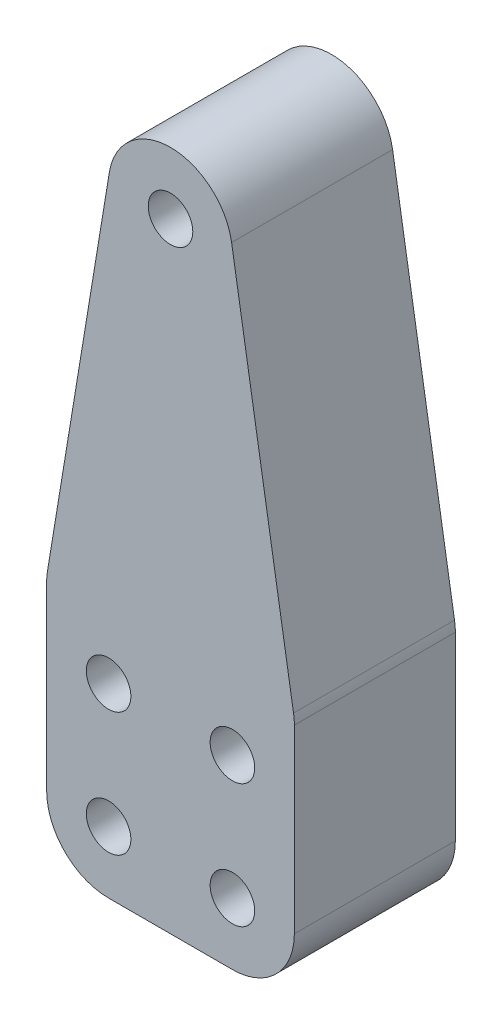
ISO-10303-21;
HEADER;
FILE_DESCRIPTION(('STEP AP214'),'2;1');
FILE_NAME('part.step','',(''),(''),'','','');
FILE_SCHEMA(('AUTOMOTIVE_DESIGN { 1 0 10303 214 1 1 1 1 }'));
ENDSEC;
DATA;
#1=APPLICATION_CONTEXT('core data for automotive mechanical design processes');
#2=APPLICATION_PROTOCOL_DEFINITION('international standard','automotive_design',2000,#1);
#3=PRODUCT_CONTEXT('',#1,'mechanical');
#4=PRODUCT('Part','Part','',(#3));
#5=PRODUCT_RELATED_PRODUCT_CATEGORY('part','',(#4));
#6=PRODUCT_DEFINITION_FORMATION('','',#4);
#7=PRODUCT_DEFINITION_CONTEXT('part definition',#1,'design');
#8=PRODUCT_DEFINITION('design','',#6,#7);
#9=PRODUCT_DEFINITION_SHAPE('','',#8);
#10=(LENGTH_UNIT() NAMED_UNIT(*) SI_UNIT(.MILLI.,.METRE.));
#11=(NAMED_UNIT(*) PLANE_ANGLE_UNIT() SI_UNIT($,.RADIAN.));
#12=(NAMED_UNIT(*) SI_UNIT($,.STERADIAN.) SOLID_ANGLE_UNIT());
#13=UNCERTAINTY_MEASURE_WITH_UNIT(LENGTH_MEASURE(1.E-05),#10,'distance_accuracy_value','');
#14=(GEOMETRIC_REPRESENTATION_CONTEXT(3) GLOBAL_UNCERTAINTY_ASSIGNED_CONTEXT((#13)) GLOBAL_UNIT_ASSIGNED_CONTEXT((#10,
#11,#12)) REPRESENTATION_CONTEXT('',''));
#15=CARTESIAN_POINT('',(0.,0.,0.));
#16=DIRECTION('',(0.,0.,1.));
#17=DIRECTION('',(1.,0.,0.));
#18=AXIS2_PLACEMENT_3D('',#15,#16,#17);
#19=CARTESIAN_POINT('',(0.,50.8,16.51));
#20=DIRECTION('',(0.,0.,1.));
#21=DIRECTION('',(1.,0.,0.));
#22=AXIS2_PLACEMENT_3D('',#19,#20,#21);
#23=PLANE('',#22);
#24=CARTESIAN_POINT('',(6.34999999999995,6.35,16.51));
#25=DIRECTION('',(0.,0.,1.));
#26=DIRECTION('',(1.,0.,0.));
#27=AXIS2_PLACEMENT_3D('',#24,#25,#26);
#28=CIRCLE('',#27,2.286);
#29=CARTESIAN_POINT('',(8.63599999999995,6.35,16.51));
#30=VERTEX_POINT('',#29);
#31=EDGE_CURVE('E258',#30,#30,#28,.T.);
#32=ORIENTED_EDGE('',*,*,#31,.F.);
#33=EDGE_LOOP('',(#32));
#34=FACE_BOUND('',#33,.T.);
#35=CARTESIAN_POINT('',(0.,50.8,16.51));
#36=DIRECTION('',(0.,0.,1.));
#37=DIRECTION('',(1.,0.,0.));
#38=AXIS2_PLACEMENT_3D('',#35,#36,#37);
#39=CIRCLE('',#38,2.286);
#40=CARTESIAN_POINT('',(2.286,50.8,16.51));
#41=VERTEX_POINT('',#40);
#42=EDGE_CURVE('E244',#41,#41,#39,.T.);
#43=ORIENTED_EDGE('',*,*,#42,.F.);
#44=EDGE_LOOP('',(#43));
#45=FACE_BOUND('',#44,.T.);
#46=DIRECTION('',(-0.16224989991992,-0.98674969975976,0.));
#47=VECTOR('',#46,1.);
#48=CARTESIAN_POINT('',(-12.7,12.7,16.51));
#49=LINE('',#48,#47);
#50=CARTESIAN_POINT('',(-6.26586059347447,51.8302868644915,16.51));
#51=VERTEX_POINT('',#50);
#52=CARTESIAN_POINT('',(-12.6158605934745,13.2117077678816,16.51));
#53=VERTEX_POINT('',#52);
#54=EDGE_CURVE('E154',#51,#53,#49,.T.);
#55=ORIENTED_EDGE('',*,*,#54,.T.);
#56=CARTESIAN_POINT('',(-6.35,12.1814209033901,16.51));
#57=DIRECTION('',(0.,0.,1.));
#58=DIRECTION('',(1.,0.,0.));
#59=AXIS2_PLACEMENT_3D('',#56,#57,#58);
#60=CIRCLE('',#59,6.35);
#61=CARTESIAN_POINT('',(-12.7,12.1814209033901,16.51));
#62=VERTEX_POINT('',#61);
#63=EDGE_CURVE('E207',#53,#62,#60,.T.);
#64=ORIENTED_EDGE('',*,*,#63,.T.);
#65=DIRECTION('',(0.,-1.,0.));
#66=VECTOR('',#65,1.);
#67=CARTESIAN_POINT('',(-12.7,-12.7,16.51));
#68=LINE('',#67,#66);
#69=CARTESIAN_POINT('',(-12.7,-6.35,16.51));
#70=VERTEX_POINT('',#69);
#71=EDGE_CURVE('E181',#62,#70,#68,.T.);
#72=ORIENTED_EDGE('',*,*,#71,.T.);
#73=CARTESIAN_POINT('',(-6.35,-6.35,16.51));
#74=DIRECTION('',(0.,0.,1.));
#75=DIRECTION('',(1.,0.,0.));
#76=AXIS2_PLACEMENT_3D('',#73,#74,#75);
#77=CIRCLE('',#76,6.35);
#78=CARTESIAN_POINT('',(-6.35,-12.7,16.51));
#79=VERTEX_POINT('',#78);
#80=EDGE_CURVE('E202',#70,#79,#77,.T.);
#81=ORIENTED_EDGE('',*,*,#80,.T.);
#82=DIRECTION('',(1.,0.,0.));
#83=VECTOR('',#82,1.);
#84=CARTESIAN_POINT('',(12.7,-12.7,16.51));
#85=LINE('',#84,#83);
#86=CARTESIAN_POINT('',(6.35,-12.7,16.51));
#87=VERTEX_POINT('',#86);
#88=EDGE_CURVE('E223',#79,#87,#85,.T.);
#89=ORIENTED_EDGE('',*,*,#88,.T.);
#90=CARTESIAN_POINT('',(6.34999999999999,-6.35,16.51));
#91=DIRECTION('',(0.,0.,1.));
#92=DIRECTION('',(1.,0.,0.));
#93=AXIS2_PLACEMENT_3D('',#90,#91,#92);
#94=CIRCLE('',#93,6.35);
#95=CARTESIAN_POINT('',(12.7,-6.35,16.51));
#96=VERTEX_POINT('',#95);
#97=EDGE_CURVE('E204',#87,#96,#94,.T.);
#98=ORIENTED_EDGE('',*,*,#97,.T.);
#99=DIRECTION('',(0.,1.,0.));
#100=VECTOR('',#99,1.);
#101=CARTESIAN_POINT('',(12.7,-12.7,16.51));
#102=LINE('',#101,#100);
#103=CARTESIAN_POINT('',(12.7,12.1814209033901,16.51));
#104=VERTEX_POINT('',#103);
#105=EDGE_CURVE('E137',#96,#104,#102,.T.);
#106=ORIENTED_EDGE('',*,*,#105,.T.);
#107=CARTESIAN_POINT('',(6.34999999999999,12.1814209033901,16.51));
#108=DIRECTION('',(0.,0.,1.));
#109=DIRECTION('',(1.,0.,0.));
#110=AXIS2_PLACEMENT_3D('',#107,#108,#109);
#111=CIRCLE('',#110,6.35);
#112=CARTESIAN_POINT('',(12.6158605934745,13.2117077678816,16.51));
#113=VERTEX_POINT('',#112);
#114=EDGE_CURVE('E58',#104,#113,#111,.T.);
#115=ORIENTED_EDGE('',*,*,#114,.T.);
#116=DIRECTION('',(-0.16224989991992,0.98674969975976,0.));
#117=VECTOR('',#116,1.);
#118=CARTESIAN_POINT('',(6.26586059347447,51.8302868644915,16.51));
#119=LINE('',#118,#117);
#120=CARTESIAN_POINT('',(6.26586059347447,51.8302868644915,16.51));
#121=VERTEX_POINT('',#120);
#122=EDGE_CURVE('E126',#113,#121,#119,.T.);
#123=ORIENTED_EDGE('',*,*,#122,.T.);
#124=CARTESIAN_POINT('',(0.,50.8,16.51));
#125=DIRECTION('',(0.,0.,1.));
#126=DIRECTION('',(1.,0.,0.));
#127=AXIS2_PLACEMENT_3D('',#124,#125,#126);
#128=CIRCLE('',#127,6.35);
#129=EDGE_CURVE('E131',#121,#51,#128,.T.);
#130=ORIENTED_EDGE('',*,*,#129,.T.);
#131=EDGE_LOOP('',(#55,#64,#72,#81,#89,#98,#106,#115,#123,#130));
#132=FACE_BOUND('',#131,.T.);
#133=CARTESIAN_POINT('',(-6.35,-6.35,16.51));
#134=DIRECTION('',(0.,0.,1.));
#135=DIRECTION('',(1.,0.,0.));
#136=AXIS2_PLACEMENT_3D('',#133,#134,#135);
#137=CIRCLE('',#136,2.286);
#138=CARTESIAN_POINT('',(-4.064,-6.35,16.51));
#139=VERTEX_POINT('',#138);
#140=EDGE_CURVE('E166',#139,#139,#137,.T.);
#141=ORIENTED_EDGE('',*,*,#140,.F.);
#142=EDGE_LOOP('',(#141));
#143=FACE_BOUND('',#142,.T.);
#144=CARTESIAN_POINT('',(6.35,-6.35,16.51));
#145=DIRECTION('',(0.,0.,1.));
#146=DIRECTION('',(1.,0.,0.));
#147=AXIS2_PLACEMENT_3D('',#144,#145,#146);
#148=CIRCLE('',#147,2.286);
#149=CARTESIAN_POINT('',(8.636,-6.35,16.51));
#150=VERTEX_POINT('',#149);
#151=EDGE_CURVE('E251',#150,#150,#148,.T.);
#152=ORIENTED_EDGE('',*,*,#151,.F.);
#153=EDGE_LOOP('',(#152));
#154=FACE_BOUND('',#153,.T.);
#155=CARTESIAN_POINT('',(-6.35000000000005,6.35,16.51));
#156=DIRECTION('',(0.,0.,1.));
#157=DIRECTION('',(1.,0.,0.));
#158=AXIS2_PLACEMENT_3D('',#155,#156,#157);
#159=CIRCLE('',#158,2.286);
#160=CARTESIAN_POINT('',(-4.06400000000005,6.35,16.51));
#161=VERTEX_POINT('',#160);
#162=EDGE_CURVE('E264',#161,#161,#159,.T.);
#163=ORIENTED_EDGE('',*,*,#162,.F.);
#164=EDGE_LOOP('',(#163));
#165=FACE_BOUND('',#164,.T.);
#166=ADVANCED_FACE('F43',(#34,#45,#132,#143,#154,#165),#23,.T.);
#167=CARTESIAN_POINT('',(0.,50.8,0.));
#168=DIRECTION('',(0.,0.,1.));
#169=DIRECTION('',(1.,0.,0.));
#170=AXIS2_PLACEMENT_3D('',#167,#168,#169);
#171=PLANE('',#170);
#172=DIRECTION('',(0.,-1.,0.));
#173=VECTOR('',#172,1.);
#174=CARTESIAN_POINT('',(-12.7,-12.7,0.));
#175=LINE('',#174,#173);
#176=CARTESIAN_POINT('',(-12.7,12.1814209033901,0.));
#177=VERTEX_POINT('',#176);
#178=CARTESIAN_POINT('',(-12.7,-6.35,0.));
#179=VERTEX_POINT('',#178);
#180=EDGE_CURVE('E161',#177,#179,#175,.T.);
#181=ORIENTED_EDGE('',*,*,#180,.F.);
#182=CARTESIAN_POINT('',(-6.35,12.1814209033901,0.));
#183=DIRECTION('',(0.,0.,1.));
#184=DIRECTION('',(1.,0.,0.));
#185=AXIS2_PLACEMENT_3D('',#182,#183,#184);
#186=CIRCLE('',#185,6.35);
#187=CARTESIAN_POINT('',(-12.6158605934745,13.2117077678816,0.));
#188=VERTEX_POINT('',#187);
#189=EDGE_CURVE('E196',#177,#188,#186,.F.);
#190=ORIENTED_EDGE('',*,*,#189,.T.);
#191=DIRECTION('',(-0.16224989991992,-0.98674969975976,0.));
#192=VECTOR('',#191,1.);
#193=CARTESIAN_POINT('',(-12.7,12.7,0.));
#194=LINE('',#193,#192);
#195=CARTESIAN_POINT('',(-6.26586059347447,51.8302868644915,0.));
#196=VERTEX_POINT('',#195);
#197=EDGE_CURVE('E177',#196,#188,#194,.T.);
#198=ORIENTED_EDGE('',*,*,#197,.F.);
#199=CARTESIAN_POINT('',(0.,50.8,0.));
#200=DIRECTION('',(0.,0.,1.));
#201=DIRECTION('',(1.,0.,0.));
#202=AXIS2_PLACEMENT_3D('',#199,#200,#201);
#203=CIRCLE('',#202,6.35);
#204=CARTESIAN_POINT('',(6.26586059347447,51.8302868644915,0.));
#205=VERTEX_POINT('',#204);
#206=EDGE_CURVE('E174',#205,#196,#203,.T.);
#207=ORIENTED_EDGE('',*,*,#206,.F.);
#208=DIRECTION('',(-0.16224989991992,0.98674969975976,0.));
#209=VECTOR('',#208,1.);
#210=CARTESIAN_POINT('',(6.26586059347447,51.8302868644915,0.));
#211=LINE('',#210,#209);
#212=CARTESIAN_POINT('',(12.6158605934745,13.2117077678816,0.));
#213=VERTEX_POINT('',#212);
#214=EDGE_CURVE('E143',#213,#205,#211,.T.);
#215=ORIENTED_EDGE('',*,*,#214,.F.);
#216=CARTESIAN_POINT('',(6.34999999999999,12.1814209033901,0.));
#217=DIRECTION('',(0.,0.,1.));
#218=DIRECTION('',(1.,0.,0.));
#219=AXIS2_PLACEMENT_3D('',#216,#217,#218);
#220=CIRCLE('',#219,6.35);
#221=CARTESIAN_POINT('',(12.7,12.1814209033901,0.));
#222=VERTEX_POINT('',#221);
#223=EDGE_CURVE('E194',#213,#222,#220,.F.);
#224=ORIENTED_EDGE('',*,*,#223,.T.);
#225=DIRECTION('',(0.,1.,0.));
#226=VECTOR('',#225,1.);
#227=CARTESIAN_POINT('',(12.7,-12.7,0.));
#228=LINE('',#227,#226);
#229=CARTESIAN_POINT('',(12.7,-6.35,0.));
#230=VERTEX_POINT('',#229);
#231=EDGE_CURVE('E170',#230,#222,#228,.T.);
#232=ORIENTED_EDGE('',*,*,#231,.F.);
#233=CARTESIAN_POINT('',(6.34999999999999,-6.35,0.));
#234=DIRECTION('',(0.,0.,1.));
#235=DIRECTION('',(1.,0.,0.));
#236=AXIS2_PLACEMENT_3D('',#233,#234,#235);
#237=CIRCLE('',#236,6.35);
#238=CARTESIAN_POINT('',(6.35,-12.7,0.));
#239=VERTEX_POINT('',#238);
#240=EDGE_CURVE('E192',#230,#239,#237,.F.);
#241=ORIENTED_EDGE('',*,*,#240,.T.);
#242=DIRECTION('',(1.,0.,0.));
#243=VECTOR('',#242,1.);
#244=CARTESIAN_POINT('',(12.7,-12.7,0.));
#245=LINE('',#244,#243);
#246=CARTESIAN_POINT('',(-6.35,-12.7,0.));
#247=VERTEX_POINT('',#246);
#248=EDGE_CURVE('E165',#247,#239,#245,.T.);
#249=ORIENTED_EDGE('',*,*,#248,.F.);
#250=CARTESIAN_POINT('',(-6.35,-6.35,0.));
#251=DIRECTION('',(0.,0.,1.));
#252=DIRECTION('',(1.,0.,0.));
#253=AXIS2_PLACEMENT_3D('',#250,#251,#252);
#254=CIRCLE('',#253,6.35);
#255=EDGE_CURVE('E189',#247,#179,#254,.F.);
#256=ORIENTED_EDGE('',*,*,#255,.T.);
#257=EDGE_LOOP('',(#181,#190,#198,#207,#215,#224,#232,#241,#249,#256));
#258=FACE_BOUND('',#257,.T.);
#259=CARTESIAN_POINT('',(-6.35,-6.35,0.));
#260=DIRECTION('',(0.,0.,1.));
#261=DIRECTION('',(1.,0.,0.));
#262=AXIS2_PLACEMENT_3D('',#259,#260,#261);
#263=CIRCLE('',#262,2.286);
#264=CARTESIAN_POINT('',(-4.064,-6.35,0.));
#265=VERTEX_POINT('',#264);
#266=EDGE_CURVE('E240',#265,#265,#263,.T.);
#267=ORIENTED_EDGE('',*,*,#266,.T.);
#268=EDGE_LOOP('',(#267));
#269=FACE_BOUND('',#268,.T.);
#270=CARTESIAN_POINT('',(0.,50.8,0.));
#271=DIRECTION('',(0.,0.,1.));
#272=DIRECTION('',(1.,0.,0.));
#273=AXIS2_PLACEMENT_3D('',#270,#271,#272);
#274=CIRCLE('',#273,2.286);
#275=CARTESIAN_POINT('',(2.286,50.8,0.));
#276=VERTEX_POINT('',#275);
#277=EDGE_CURVE('E247',#276,#276,#274,.T.);
#278=ORIENTED_EDGE('',*,*,#277,.T.);
#279=EDGE_LOOP('',(#278));
#280=FACE_BOUND('',#279,.T.);
#281=CARTESIAN_POINT('',(6.35,-6.35,0.));
#282=DIRECTION('',(0.,0.,1.));
#283=DIRECTION('',(1.,0.,0.));
#284=AXIS2_PLACEMENT_3D('',#281,#282,#283);
#285=CIRCLE('',#284,2.286);
#286=CARTESIAN_POINT('',(8.636,-6.35,0.));
#287=VERTEX_POINT('',#286);
#288=EDGE_CURVE('E255',#287,#287,#285,.T.);
#289=ORIENTED_EDGE('',*,*,#288,.T.);
#290=EDGE_LOOP('',(#289));
#291=FACE_BOUND('',#290,.T.);
#292=CARTESIAN_POINT('',(6.34999999999995,6.35,0.));
#293=DIRECTION('',(0.,0.,1.));
#294=DIRECTION('',(1.,0.,0.));
#295=AXIS2_PLACEMENT_3D('',#292,#293,#294);
#296=CIRCLE('',#295,2.286);
#297=CARTESIAN_POINT('',(8.63599999999995,6.35,0.));
#298=VERTEX_POINT('',#297);
#299=EDGE_CURVE('E261',#298,#298,#296,.T.);
#300=ORIENTED_EDGE('',*,*,#299,.T.);
#301=EDGE_LOOP('',(#300));
#302=FACE_BOUND('',#301,.T.);
#303=CARTESIAN_POINT('',(-6.35000000000005,6.35,0.));
#304=DIRECTION('',(0.,0.,1.));
#305=DIRECTION('',(1.,0.,0.));
#306=AXIS2_PLACEMENT_3D('',#303,#304,#305);
#307=CIRCLE('',#306,2.286);
#308=CARTESIAN_POINT('',(-4.06400000000005,6.35,0.));
#309=VERTEX_POINT('',#308);
#310=EDGE_CURVE('E267',#309,#309,#307,.T.);
#311=ORIENTED_EDGE('',*,*,#310,.T.);
#312=EDGE_LOOP('',(#311));
#313=FACE_BOUND('',#312,.T.);
#314=ADVANCED_FACE('F228',(#258,#269,#280,#291,#302,#313),#171,.F.);
#315=CARTESIAN_POINT('',(-12.7,-12.7,16.51));
#316=DIRECTION('',(1.,0.,0.));
#317=DIRECTION('',(0.,0.,-1.));
#318=AXIS2_PLACEMENT_3D('',#315,#316,#317);
#319=PLANE('',#318);
#320=ORIENTED_EDGE('',*,*,#71,.F.);
#321=DIRECTION('',(0.,0.,-1.));
#322=VECTOR('',#321,1.);
#323=CARTESIAN_POINT('',(-12.7,12.1814209033901,16.51));
#324=LINE('',#323,#322);
#325=EDGE_CURVE('E185',#62,#177,#324,.T.);
#326=ORIENTED_EDGE('',*,*,#325,.T.);
#327=ORIENTED_EDGE('',*,*,#180,.T.);
#328=DIRECTION('',(0.,0.,-1.));
#329=VECTOR('',#328,1.);
#330=CARTESIAN_POINT('',(-12.7,-6.35,16.51));
#331=LINE('',#330,#329);
#332=EDGE_CURVE('E147',#179,#70,#331,.F.);
#333=ORIENTED_EDGE('',*,*,#332,.T.);
#334=EDGE_LOOP('',(#320,#326,#327,#333));
#335=FACE_BOUND('',#334,.T.);
#336=ADVANCED_FACE('F283',(#335),#319,.F.);
#337=CARTESIAN_POINT('',(12.7,-12.7,16.51));
#338=DIRECTION('',(0.,1.,0.));
#339=DIRECTION('',(-1.,0.,0.));
#340=AXIS2_PLACEMENT_3D('',#337,#338,#339);
#341=PLANE('',#340);
#342=ORIENTED_EDGE('',*,*,#248,.T.);
#343=DIRECTION('',(0.,0.,-1.));
#344=VECTOR('',#343,1.);
#345=CARTESIAN_POINT('',(6.35,-12.7,16.51));
#346=LINE('',#345,#344);
#347=EDGE_CURVE('E11',#239,#87,#346,.F.);
#348=ORIENTED_EDGE('',*,*,#347,.T.);
#349=ORIENTED_EDGE('',*,*,#88,.F.);
#350=DIRECTION('',(0.,0.,-1.));
#351=VECTOR('',#350,1.);
#352=CARTESIAN_POINT('',(-6.35,-12.7,16.51));
#353=LINE('',#352,#351);
#354=EDGE_CURVE('E51',#79,#247,#353,.T.);
#355=ORIENTED_EDGE('',*,*,#354,.T.);
#356=EDGE_LOOP('',(#342,#348,#349,#355));
#357=FACE_BOUND('',#356,.T.);
#358=ADVANCED_FACE('F220',(#357),#341,.F.);
#359=CARTESIAN_POINT('',(12.7,-12.7,16.51));
#360=DIRECTION('',(-1.,0.,0.));
#361=DIRECTION('',(0.,0.,1.));
#362=AXIS2_PLACEMENT_3D('',#359,#360,#361);
#363=PLANE('',#362);
#364=ORIENTED_EDGE('',*,*,#231,.T.);
#365=DIRECTION('',(0.,0.,-1.));
#366=VECTOR('',#365,1.);
#367=CARTESIAN_POINT('',(12.7,12.1814209033901,16.51));
#368=LINE('',#367,#366);
#369=EDGE_CURVE('E66',#222,#104,#368,.F.);
#370=ORIENTED_EDGE('',*,*,#369,.T.);
#371=ORIENTED_EDGE('',*,*,#105,.F.);
#372=DIRECTION('',(0.,0.,-1.));
#373=VECTOR('',#372,1.);
#374=CARTESIAN_POINT('',(12.7,-6.35,16.51));
#375=LINE('',#374,#373);
#376=EDGE_CURVE('E211',#96,#230,#375,.T.);
#377=ORIENTED_EDGE('',*,*,#376,.T.);
#378=EDGE_LOOP('',(#364,#370,#371,#377));
#379=FACE_BOUND('',#378,.T.);
#380=ADVANCED_FACE('F235',(#379),#363,.F.);
#381=CARTESIAN_POINT('',(6.26586059347447,51.8302868644915,16.51));
#382=DIRECTION('',(-0.98674969975976,-0.16224989991992,0.));
#383=DIRECTION('',(0.16224989991992,-0.98674969975976,0.));
#384=AXIS2_PLACEMENT_3D('',#381,#382,#383);
#385=PLANE('',#384);
#386=ORIENTED_EDGE('',*,*,#122,.F.);
#387=DIRECTION('',(0.,0.,-1.));
#388=VECTOR('',#387,1.);
#389=CARTESIAN_POINT('',(12.6158605934745,13.2117077678816,16.51));
#390=LINE('',#389,#388);
#391=EDGE_CURVE('E209',#113,#213,#390,.T.);
#392=ORIENTED_EDGE('',*,*,#391,.T.);
#393=ORIENTED_EDGE('',*,*,#214,.T.);
#394=DIRECTION('',(0.,0.,-1.));
#395=VECTOR('',#394,1.);
#396=CARTESIAN_POINT('',(6.26586059347447,51.8302868644915,16.51));
#397=LINE('',#396,#395);
#398=EDGE_CURVE('E140',#121,#205,#397,.T.);
#399=ORIENTED_EDGE('',*,*,#398,.F.);
#400=EDGE_LOOP('',(#386,#392,#393,#399));
#401=FACE_BOUND('',#400,.T.);
#402=ADVANCED_FACE('F141',(#401),#385,.F.);
#403=CARTESIAN_POINT('',(0.,50.8,16.51));
#404=DIRECTION('',(0.,0.,-1.));
#405=DIRECTION('',(-1.,0.,0.));
#406=AXIS2_PLACEMENT_3D('',#403,#404,#405);
#407=CYLINDRICAL_SURFACE('',#406,6.35);
#408=ORIENTED_EDGE('',*,*,#206,.T.);
#409=DIRECTION('',(0.,0.,-1.));
#410=VECTOR('',#409,1.);
#411=CARTESIAN_POINT('',(-6.26586059347447,51.8302868644915,16.51));
#412=LINE('',#411,#410);
#413=EDGE_CURVE('E148',#51,#196,#412,.T.);
#414=ORIENTED_EDGE('',*,*,#413,.F.);
#415=ORIENTED_EDGE('',*,*,#129,.F.);
#416=ORIENTED_EDGE('',*,*,#398,.T.);
#417=EDGE_LOOP('',(#408,#414,#415,#416));
#418=FACE_BOUND('',#417,.T.);
#419=ADVANCED_FACE('F150',(#418),#407,.T.);
#420=CARTESIAN_POINT('',(-12.7,12.7,16.51));
#421=DIRECTION('',(0.98674969975976,-0.16224989991992,0.));
#422=DIRECTION('',(0.16224989991992,0.98674969975976,0.));
#423=AXIS2_PLACEMENT_3D('',#420,#421,#422);
#424=PLANE('',#423);
#425=ORIENTED_EDGE('',*,*,#197,.T.);
#426=DIRECTION('',(0.,0.,-1.));
#427=VECTOR('',#426,1.);
#428=CARTESIAN_POINT('',(-12.6158605934745,13.2117077678816,16.51));
#429=LINE('',#428,#427);
#430=EDGE_CURVE('E199',#188,#53,#429,.F.);
#431=ORIENTED_EDGE('',*,*,#430,.T.);
#432=ORIENTED_EDGE('',*,*,#54,.F.);
#433=ORIENTED_EDGE('',*,*,#413,.T.);
#434=EDGE_LOOP('',(#425,#431,#432,#433));
#435=FACE_BOUND('',#434,.T.);
#436=ADVANCED_FACE('F291',(#435),#424,.F.);
#437=CARTESIAN_POINT('',(-6.35,-6.35,16.51));
#438=DIRECTION('',(0.,0.,-1.));
#439=DIRECTION('',(-1.,0.,0.));
#440=AXIS2_PLACEMENT_3D('',#437,#438,#439);
#441=CYLINDRICAL_SURFACE('',#440,2.286);
#442=ORIENTED_EDGE('',*,*,#140,.T.);
#443=EDGE_LOOP('',(#442));
#444=FACE_BOUND('',#443,.T.);
#445=ORIENTED_EDGE('',*,*,#266,.F.);
#446=EDGE_LOOP('',(#445));
#447=FACE_BOUND('',#446,.T.);
#448=ADVANCED_FACE('F288',(#444,#447),#441,.F.);
#449=CARTESIAN_POINT('',(0.,50.8,16.51));
#450=DIRECTION('',(0.,0.,-1.));
#451=DIRECTION('',(-1.,0.,0.));
#452=AXIS2_PLACEMENT_3D('',#449,#450,#451);
#453=CYLINDRICAL_SURFACE('',#452,2.286);
#454=ORIENTED_EDGE('',*,*,#42,.T.);
#455=EDGE_LOOP('',(#454));
#456=FACE_BOUND('',#455,.T.);
#457=ORIENTED_EDGE('',*,*,#277,.F.);
#458=EDGE_LOOP('',(#457));
#459=FACE_BOUND('',#458,.T.);
#460=ADVANCED_FACE('F413',(#456,#459),#453,.F.);
#461=CARTESIAN_POINT('',(6.35,-6.35,16.51));
#462=DIRECTION('',(0.,0.,-1.));
#463=DIRECTION('',(-1.,0.,0.));
#464=AXIS2_PLACEMENT_3D('',#461,#462,#463);
#465=CYLINDRICAL_SURFACE('',#464,2.286);
#466=ORIENTED_EDGE('',*,*,#151,.T.);
#467=EDGE_LOOP('',(#466));
#468=FACE_BOUND('',#467,.T.);
#469=ORIENTED_EDGE('',*,*,#288,.F.);
#470=EDGE_LOOP('',(#469));
#471=FACE_BOUND('',#470,.T.);
#472=ADVANCED_FACE('F403',(#468,#471),#465,.F.);
#473=CARTESIAN_POINT('',(6.34999999999995,6.35,16.51));
#474=DIRECTION('',(0.,0.,-1.));
#475=DIRECTION('',(-1.,0.,0.));
#476=AXIS2_PLACEMENT_3D('',#473,#474,#475);
#477=CYLINDRICAL_SURFACE('',#476,2.286);
#478=ORIENTED_EDGE('',*,*,#31,.T.);
#479=EDGE_LOOP('',(#478));
#480=FACE_BOUND('',#479,.T.);
#481=ORIENTED_EDGE('',*,*,#299,.F.);
#482=EDGE_LOOP('',(#481));
#483=FACE_BOUND('',#482,.T.);
#484=ADVANCED_FACE('F394',(#480,#483),#477,.F.);
#485=CARTESIAN_POINT('',(-6.35000000000005,6.35,16.51));
#486=DIRECTION('',(0.,0.,-1.));
#487=DIRECTION('',(-1.,0.,0.));
#488=AXIS2_PLACEMENT_3D('',#485,#486,#487);
#489=CYLINDRICAL_SURFACE('',#488,2.286);
#490=ORIENTED_EDGE('',*,*,#162,.T.);
#491=EDGE_LOOP('',(#490));
#492=FACE_BOUND('',#491,.T.);
#493=ORIENTED_EDGE('',*,*,#310,.F.);
#494=EDGE_LOOP('',(#493));
#495=FACE_BOUND('',#494,.T.);
#496=ADVANCED_FACE('F274',(#492,#495),#489,.F.);
#497=CARTESIAN_POINT('',(-6.35,12.1814209033901,16.51));
#498=DIRECTION('',(0.,0.,-1.));
#499=DIRECTION('',(-1.,0.,0.));
#500=AXIS2_PLACEMENT_3D('',#497,#498,#499);
#501=CYLINDRICAL_SURFACE('',#500,6.35);
#502=ORIENTED_EDGE('',*,*,#63,.F.);
#503=ORIENTED_EDGE('',*,*,#430,.F.);
#504=ORIENTED_EDGE('',*,*,#189,.F.);
#505=ORIENTED_EDGE('',*,*,#325,.F.);
#506=EDGE_LOOP('',(#502,#503,#504,#505));
#507=FACE_BOUND('',#506,.T.);
#508=ADVANCED_FACE('F306',(#507),#501,.T.);
#509=CARTESIAN_POINT('',(6.34999999999999,12.1814209033901,16.51));
#510=DIRECTION('',(0.,0.,-1.));
#511=DIRECTION('',(-1.,0.,0.));
#512=AXIS2_PLACEMENT_3D('',#509,#510,#511);
#513=CYLINDRICAL_SURFACE('',#512,6.35);
#514=ORIENTED_EDGE('',*,*,#114,.F.);
#515=ORIENTED_EDGE('',*,*,#369,.F.);
#516=ORIENTED_EDGE('',*,*,#223,.F.);
#517=ORIENTED_EDGE('',*,*,#391,.F.);
#518=EDGE_LOOP('',(#514,#515,#516,#517));
#519=FACE_BOUND('',#518,.T.);
#520=ADVANCED_FACE('F309',(#519),#513,.T.);
#521=CARTESIAN_POINT('',(6.34999999999999,-6.35,16.51));
#522=DIRECTION('',(0.,0.,-1.));
#523=DIRECTION('',(-1.,0.,0.));
#524=AXIS2_PLACEMENT_3D('',#521,#522,#523);
#525=CYLINDRICAL_SURFACE('',#524,6.35);
#526=ORIENTED_EDGE('',*,*,#97,.F.);
#527=ORIENTED_EDGE('',*,*,#347,.F.);
#528=ORIENTED_EDGE('',*,*,#240,.F.);
#529=ORIENTED_EDGE('',*,*,#376,.F.);
#530=EDGE_LOOP('',(#526,#527,#528,#529));
#531=FACE_BOUND('',#530,.T.);
#532=ADVANCED_FACE('F234',(#531),#525,.T.);
#533=CARTESIAN_POINT('',(-6.35,-6.35,16.51));
#534=DIRECTION('',(0.,0.,-1.));
#535=DIRECTION('',(-1.,0.,0.));
#536=AXIS2_PLACEMENT_3D('',#533,#534,#535);
#537=CYLINDRICAL_SURFACE('',#536,6.35);
#538=ORIENTED_EDGE('',*,*,#80,.F.);
#539=ORIENTED_EDGE('',*,*,#332,.F.);
#540=ORIENTED_EDGE('',*,*,#255,.F.);
#541=ORIENTED_EDGE('',*,*,#354,.F.);
#542=EDGE_LOOP('',(#538,#539,#540,#541));
#543=FACE_BOUND('',#542,.T.);
#544=ADVANCED_FACE('F45',(#543),#537,.T.);
#545=CLOSED_SHELL('',(#166,#314,#336,#358,#380,#402,#419,#436,#448,#460,#472,#484,#496,#508,
#520,#532,#544));
#546=MANIFOLD_SOLID_BREP('B2',#545);
#547=ADVANCED_BREP_SHAPE_REPRESENTATION('',(#18,#546),#14);
#548=SHAPE_DEFINITION_REPRESENTATION(#9,#547);
ENDSEC;
END-ISO-10303-21;
